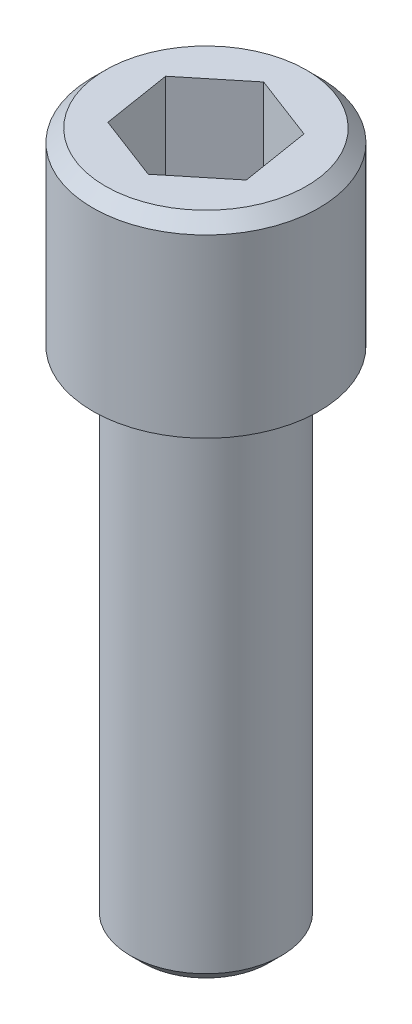
ISO-10303-21;
HEADER;
FILE_DESCRIPTION(('STEP AP214'),'2;1');
FILE_NAME('part.step','',(''),(''),'','','');
FILE_SCHEMA(('AUTOMOTIVE_DESIGN { 1 0 10303 214 1 1 1 1 }'));
ENDSEC;
DATA;
#1=APPLICATION_CONTEXT('core data for automotive mechanical design processes');
#2=APPLICATION_PROTOCOL_DEFINITION('international standard','automotive_design',2000,#1);
#3=PRODUCT_CONTEXT('',#1,'mechanical');
#4=PRODUCT('Part','Part','',(#3));
#5=PRODUCT_RELATED_PRODUCT_CATEGORY('part','',(#4));
#6=PRODUCT_DEFINITION_FORMATION('','',#4);
#7=PRODUCT_DEFINITION_CONTEXT('part definition',#1,'design');
#8=PRODUCT_DEFINITION('design','',#6,#7);
#9=PRODUCT_DEFINITION_SHAPE('','',#8);
#10=(LENGTH_UNIT() NAMED_UNIT(*) SI_UNIT(.MILLI.,.METRE.));
#11=(NAMED_UNIT(*) PLANE_ANGLE_UNIT() SI_UNIT($,.RADIAN.));
#12=(NAMED_UNIT(*) SI_UNIT($,.STERADIAN.) SOLID_ANGLE_UNIT());
#13=UNCERTAINTY_MEASURE_WITH_UNIT(LENGTH_MEASURE(1.E-05),#10,'distance_accuracy_value','');
#14=(GEOMETRIC_REPRESENTATION_CONTEXT(3) GLOBAL_UNCERTAINTY_ASSIGNED_CONTEXT((#13)) GLOBAL_UNIT_ASSIGNED_CONTEXT((#10,
#11,#12)) REPRESENTATION_CONTEXT('',''));
#15=CARTESIAN_POINT('',(0.,0.,0.));
#16=DIRECTION('',(0.,0.,1.));
#17=DIRECTION('',(1.,0.,0.));
#18=AXIS2_PLACEMENT_3D('',#15,#16,#17);
#19=CARTESIAN_POINT('',(0.,10.,0.));
#20=DIRECTION('',(0.,-1.,0.));
#21=DIRECTION('',(0.,0.,-1.));
#22=AXIS2_PLACEMENT_3D('',#19,#20,#21);
#23=CYLINDRICAL_SURFACE('',#22,1.5);
#24=CARTESIAN_POINT('',(0.,0.25,0.));
#25=DIRECTION('',(0.,1.,0.));
#26=DIRECTION('',(0.,0.,1.));
#27=AXIS2_PLACEMENT_3D('',#24,#25,#26);
#28=CIRCLE('',#27,1.5);
#29=CARTESIAN_POINT('',(0.,0.25,1.5));
#30=VERTEX_POINT('',#29);
#31=EDGE_CURVE('E41',#30,#30,#28,.T.);
#32=ORIENTED_EDGE('',*,*,#31,.T.);
#33=EDGE_LOOP('',(#32));
#34=FACE_BOUND('',#33,.T.);
#35=CARTESIAN_POINT('',(0.,10.,0.));
#36=DIRECTION('',(0.,1.,0.));
#37=DIRECTION('',(0.,0.,1.));
#38=AXIS2_PLACEMENT_3D('',#35,#36,#37);
#39=CIRCLE('',#38,1.5);
#40=CARTESIAN_POINT('',(0.,10.,1.5));
#41=VERTEX_POINT('',#40);
#42=EDGE_CURVE('E143',#41,#41,#39,.T.);
#43=ORIENTED_EDGE('',*,*,#42,.F.);
#44=EDGE_LOOP('',(#43));
#45=FACE_BOUND('',#44,.T.);
#46=ADVANCED_FACE('F33',(#34,#45),#23,.T.);
#47=CARTESIAN_POINT('',(0.,0.,0.));
#48=DIRECTION('',(0.,1.,0.));
#49=DIRECTION('',(0.,0.,1.));
#50=AXIS2_PLACEMENT_3D('',#47,#48,#49);
#51=PLANE('',#50);
#52=CARTESIAN_POINT('',(0.,0.,0.));
#53=DIRECTION('',(0.,1.,0.));
#54=DIRECTION('',(0.,0.,1.));
#55=AXIS2_PLACEMENT_3D('',#52,#53,#54);
#56=CIRCLE('',#55,1.25);
#57=CARTESIAN_POINT('',(0.,0.,1.25));
#58=VERTEX_POINT('',#57);
#59=EDGE_CURVE('E11',#58,#58,#56,.F.);
#60=ORIENTED_EDGE('',*,*,#59,.T.);
#61=EDGE_LOOP('',(#60));
#62=FACE_BOUND('',#61,.T.);
#63=ADVANCED_FACE('F165',(#62),#51,.F.);
#64=CARTESIAN_POINT('',(0.,13.75,0.));
#65=DIRECTION('',(0.,-1.,0.));
#66=DIRECTION('',(0.,0.,-1.));
#67=AXIS2_PLACEMENT_3D('',#64,#65,#66);
#68=CYLINDRICAL_SURFACE('',#67,2.25);
#69=CARTESIAN_POINT('',(0.,13.5,0.));
#70=DIRECTION('',(0.,1.,0.));
#71=DIRECTION('',(0.,0.,1.));
#72=AXIS2_PLACEMENT_3D('',#69,#70,#71);
#73=CIRCLE('',#72,2.25);
#74=CARTESIAN_POINT('',(0.,13.5,2.25));
#75=VERTEX_POINT('',#74);
#76=EDGE_CURVE('E149',#75,#75,#73,.F.);
#77=ORIENTED_EDGE('',*,*,#76,.T.);
#78=EDGE_LOOP('',(#77));
#79=FACE_BOUND('',#78,.T.);
#80=CARTESIAN_POINT('',(0.,10.,0.));
#81=DIRECTION('',(0.,1.,0.));
#82=DIRECTION('',(0.,0.,1.));
#83=AXIS2_PLACEMENT_3D('',#80,#81,#82);
#84=CIRCLE('',#83,2.25);
#85=CARTESIAN_POINT('',(0.,10.,2.25));
#86=VERTEX_POINT('',#85);
#87=EDGE_CURVE('E135',#86,#86,#84,.T.);
#88=ORIENTED_EDGE('',*,*,#87,.T.);
#89=EDGE_LOOP('',(#88));
#90=FACE_BOUND('',#89,.T.);
#91=ADVANCED_FACE('F170',(#79,#90),#68,.T.);
#92=CARTESIAN_POINT('',(0.,13.75,0.));
#93=DIRECTION('',(0.,1.,0.));
#94=DIRECTION('',(0.,0.,1.));
#95=AXIS2_PLACEMENT_3D('',#92,#93,#94);
#96=PLANE('',#95);
#97=CARTESIAN_POINT('',(0.,13.75,0.));
#98=DIRECTION('',(0.,1.,0.));
#99=DIRECTION('',(0.,0.,1.));
#100=AXIS2_PLACEMENT_3D('',#97,#98,#99);
#101=CIRCLE('',#100,2.);
#102=CARTESIAN_POINT('',(0.,13.75,2.));
#103=VERTEX_POINT('',#102);
#104=EDGE_CURVE('E146',#103,#103,#101,.T.);
#105=ORIENTED_EDGE('',*,*,#104,.T.);
#106=EDGE_LOOP('',(#105));
#107=FACE_BOUND('',#106,.T.);
#108=DIRECTION('',(0.159195520088402,0.,0.987247074639263));
#109=VECTOR('',#108,1.);
#110=CARTESIAN_POINT('',(-1.2949903812193,13.75,-0.492950213053497));
#111=LINE('',#110,#109);
#112=CARTESIAN_POINT('',(-1.2949903812193,13.75,-0.492950213053497));
#113=VERTEX_POINT('',#112);
#114=CARTESIAN_POINT('',(-1.07440259791493,13.75,0.875019461265662));
#115=VERTEX_POINT('',#114);
#116=EDGE_CURVE('E48',#113,#115,#111,.T.);
#117=ORIENTED_EDGE('',*,*,#116,.F.);
#118=DIRECTION('',(-0.775383286405273,0.,0.631490901884864));
#119=VECTOR('',#118,1.);
#120=CARTESIAN_POINT('',(-0.220587783304371,13.75,-1.36796967431916));
#121=LINE('',#120,#119);
#122=CARTESIAN_POINT('',(-0.220587783304371,13.75,-1.36796967431916));
#123=VERTEX_POINT('',#122);
#124=EDGE_CURVE('E131',#123,#113,#121,.T.);
#125=ORIENTED_EDGE('',*,*,#124,.F.);
#126=DIRECTION('',(-0.934578806493675,0.,-0.3557561727544));
#127=VECTOR('',#126,1.);
#128=CARTESIAN_POINT('',(1.07440259791493,13.75,-0.875019461265662));
#129=LINE('',#128,#127);
#130=CARTESIAN_POINT('',(1.07440259791493,13.75,-0.875019461265662));
#131=VERTEX_POINT('',#130);
#132=EDGE_CURVE('E129',#131,#123,#129,.T.);
#133=ORIENTED_EDGE('',*,*,#132,.F.);
#134=DIRECTION('',(-0.159195520088402,0.,-0.987247074639263));
#135=VECTOR('',#134,1.);
#136=CARTESIAN_POINT('',(1.2949903812193,13.75,0.492950213053496));
#137=LINE('',#136,#135);
#138=CARTESIAN_POINT('',(1.2949903812193,13.75,0.492950213053496));
#139=VERTEX_POINT('',#138);
#140=EDGE_CURVE('E96',#139,#131,#137,.T.);
#141=ORIENTED_EDGE('',*,*,#140,.F.);
#142=DIRECTION('',(0.775383286405273,0.,-0.631490901884864));
#143=VECTOR('',#142,1.);
#144=CARTESIAN_POINT('',(0.220587783304371,13.75,1.36796967431916));
#145=LINE('',#144,#143);
#146=CARTESIAN_POINT('',(0.220587783304371,13.75,1.36796967431916));
#147=VERTEX_POINT('',#146);
#148=EDGE_CURVE('E125',#147,#139,#145,.T.);
#149=ORIENTED_EDGE('',*,*,#148,.F.);
#150=DIRECTION('',(0.934578806493675,0.,0.3557561727544));
#151=VECTOR('',#150,1.);
#152=CARTESIAN_POINT('',(-1.07440259791493,13.75,0.875019461265662));
#153=LINE('',#152,#151);
#154=EDGE_CURVE('E122',#115,#147,#153,.T.);
#155=ORIENTED_EDGE('',*,*,#154,.F.);
#156=EDGE_LOOP('',(#117,#125,#133,#141,#149,#155));
#157=FACE_BOUND('',#156,.T.);
#158=ADVANCED_FACE('F176',(#107,#157),#96,.T.);
#159=CARTESIAN_POINT('',(0.,10.,0.));
#160=DIRECTION('',(0.,1.,0.));
#161=DIRECTION('',(0.,0.,1.));
#162=AXIS2_PLACEMENT_3D('',#159,#160,#161);
#163=PLANE('',#162);
#164=ORIENTED_EDGE('',*,*,#42,.T.);
#165=EDGE_LOOP('',(#164));
#166=FACE_BOUND('',#165,.T.);
#167=ORIENTED_EDGE('',*,*,#87,.F.);
#168=EDGE_LOOP('',(#167));
#169=FACE_BOUND('',#168,.T.);
#170=ADVANCED_FACE('F178',(#166,#169),#163,.F.);
#171=CARTESIAN_POINT('',(-1.2949903812193,11.5,-0.492950213053497));
#172=DIRECTION('',(-0.987247074639263,0.,0.159195520088402));
#173=DIRECTION('',(0.159195520088402,0.,0.987247074639263));
#174=AXIS2_PLACEMENT_3D('',#171,#172,#173);
#175=PLANE('',#174);
#176=ORIENTED_EDGE('',*,*,#116,.T.);
#177=DIRECTION('',(0.,1.,0.));
#178=VECTOR('',#177,1.);
#179=CARTESIAN_POINT('',(-1.07440259791493,11.5,0.875019461265662));
#180=LINE('',#179,#178);
#181=CARTESIAN_POINT('',(-1.07440259791493,11.5,0.875019461265662));
#182=VERTEX_POINT('',#181);
#183=EDGE_CURVE('E78',#182,#115,#180,.T.);
#184=ORIENTED_EDGE('',*,*,#183,.F.);
#185=DIRECTION('',(0.159195520088402,0.,0.987247074639263));
#186=VECTOR('',#185,1.);
#187=CARTESIAN_POINT('',(-1.2949903812193,11.5,-0.492950213053497));
#188=LINE('',#187,#186);
#189=CARTESIAN_POINT('',(-1.2949903812193,11.5,-0.492950213053497));
#190=VERTEX_POINT('',#189);
#191=EDGE_CURVE('E133',#190,#182,#188,.T.);
#192=ORIENTED_EDGE('',*,*,#191,.F.);
#193=DIRECTION('',(0.,1.,0.));
#194=VECTOR('',#193,1.);
#195=CARTESIAN_POINT('',(-1.2949903812193,11.5,-0.492950213053497));
#196=LINE('',#195,#194);
#197=EDGE_CURVE('E56',#190,#113,#196,.T.);
#198=ORIENTED_EDGE('',*,*,#197,.T.);
#199=EDGE_LOOP('',(#176,#184,#192,#198));
#200=FACE_BOUND('',#199,.T.);
#201=ADVANCED_FACE('F181',(#200),#175,.F.);
#202=CARTESIAN_POINT('',(-0.220587783304371,11.5,-1.36796967431916));
#203=DIRECTION('',(-0.631490901884864,0.,-0.775383286405273));
#204=DIRECTION('',(-0.775383286405273,0.,0.631490901884864));
#205=AXIS2_PLACEMENT_3D('',#202,#203,#204);
#206=PLANE('',#205);
#207=ORIENTED_EDGE('',*,*,#124,.T.);
#208=ORIENTED_EDGE('',*,*,#197,.F.);
#209=DIRECTION('',(-0.775383286405273,0.,0.631490901884864));
#210=VECTOR('',#209,1.);
#211=CARTESIAN_POINT('',(-0.220587783304371,11.5,-1.36796967431916));
#212=LINE('',#211,#210);
#213=CARTESIAN_POINT('',(-0.220587783304371,11.5,-1.36796967431916));
#214=VERTEX_POINT('',#213);
#215=EDGE_CURVE('E108',#214,#190,#212,.T.);
#216=ORIENTED_EDGE('',*,*,#215,.F.);
#217=DIRECTION('',(0.,1.,0.));
#218=VECTOR('',#217,1.);
#219=CARTESIAN_POINT('',(-0.220587783304371,11.5,-1.36796967431916));
#220=LINE('',#219,#218);
#221=EDGE_CURVE('E100',#214,#123,#220,.T.);
#222=ORIENTED_EDGE('',*,*,#221,.T.);
#223=EDGE_LOOP('',(#207,#208,#216,#222));
#224=FACE_BOUND('',#223,.T.);
#225=ADVANCED_FACE('F188',(#224),#206,.F.);
#226=CARTESIAN_POINT('',(1.07440259791493,11.5,-0.875019461265662));
#227=DIRECTION('',(0.3557561727544,0.,-0.934578806493675));
#228=DIRECTION('',(-0.934578806493675,0.,-0.3557561727544));
#229=AXIS2_PLACEMENT_3D('',#226,#227,#228);
#230=PLANE('',#229);
#231=ORIENTED_EDGE('',*,*,#132,.T.);
#232=ORIENTED_EDGE('',*,*,#221,.F.);
#233=DIRECTION('',(-0.934578806493675,0.,-0.3557561727544));
#234=VECTOR('',#233,1.);
#235=CARTESIAN_POINT('',(1.07440259791493,11.5,-0.875019461265662));
#236=LINE('',#235,#234);
#237=CARTESIAN_POINT('',(1.07440259791493,11.5,-0.875019461265662));
#238=VERTEX_POINT('',#237);
#239=EDGE_CURVE('E104',#238,#214,#236,.T.);
#240=ORIENTED_EDGE('',*,*,#239,.F.);
#241=DIRECTION('',(0.,1.,0.));
#242=VECTOR('',#241,1.);
#243=CARTESIAN_POINT('',(1.07440259791493,11.5,-0.875019461265662));
#244=LINE('',#243,#242);
#245=EDGE_CURVE('E89',#238,#131,#244,.T.);
#246=ORIENTED_EDGE('',*,*,#245,.T.);
#247=EDGE_LOOP('',(#231,#232,#240,#246));
#248=FACE_BOUND('',#247,.T.);
#249=ADVANCED_FACE('F105',(#248),#230,.F.);
#250=CARTESIAN_POINT('',(1.2949903812193,11.5,0.492950213053496));
#251=DIRECTION('',(0.987247074639263,0.,-0.159195520088402));
#252=DIRECTION('',(-0.159195520088403,0.,-0.987247074639263));
#253=AXIS2_PLACEMENT_3D('',#250,#251,#252);
#254=PLANE('',#253);
#255=ORIENTED_EDGE('',*,*,#140,.T.);
#256=ORIENTED_EDGE('',*,*,#245,.F.);
#257=DIRECTION('',(-0.159195520088402,0.,-0.987247074639263));
#258=VECTOR('',#257,1.);
#259=CARTESIAN_POINT('',(1.2949903812193,11.5,0.492950213053496));
#260=LINE('',#259,#258);
#261=CARTESIAN_POINT('',(1.2949903812193,11.5,0.492950213053496));
#262=VERTEX_POINT('',#261);
#263=EDGE_CURVE('E93',#262,#238,#260,.T.);
#264=ORIENTED_EDGE('',*,*,#263,.F.);
#265=DIRECTION('',(0.,1.,0.));
#266=VECTOR('',#265,1.);
#267=CARTESIAN_POINT('',(1.2949903812193,11.5,0.492950213053496));
#268=LINE('',#267,#266);
#269=EDGE_CURVE('E101',#262,#139,#268,.T.);
#270=ORIENTED_EDGE('',*,*,#269,.T.);
#271=EDGE_LOOP('',(#255,#256,#264,#270));
#272=FACE_BOUND('',#271,.T.);
#273=ADVANCED_FACE('F91',(#272),#254,.F.);
#274=CARTESIAN_POINT('',(0.220587783304371,11.5,1.36796967431916));
#275=DIRECTION('',(0.631490901884864,0.,0.775383286405273));
#276=DIRECTION('',(0.775383286405273,0.,-0.631490901884864));
#277=AXIS2_PLACEMENT_3D('',#274,#275,#276);
#278=PLANE('',#277);
#279=ORIENTED_EDGE('',*,*,#148,.T.);
#280=ORIENTED_EDGE('',*,*,#269,.F.);
#281=DIRECTION('',(0.775383286405273,0.,-0.631490901884864));
#282=VECTOR('',#281,1.);
#283=CARTESIAN_POINT('',(0.220587783304371,11.5,1.36796967431916));
#284=LINE('',#283,#282);
#285=CARTESIAN_POINT('',(0.220587783304371,11.5,1.36796967431916));
#286=VERTEX_POINT('',#285);
#287=EDGE_CURVE('E114',#286,#262,#284,.T.);
#288=ORIENTED_EDGE('',*,*,#287,.F.);
#289=DIRECTION('',(0.,1.,0.));
#290=VECTOR('',#289,1.);
#291=CARTESIAN_POINT('',(0.220587783304371,11.5,1.36796967431916));
#292=LINE('',#291,#290);
#293=EDGE_CURVE('E138',#286,#147,#292,.T.);
#294=ORIENTED_EDGE('',*,*,#293,.T.);
#295=EDGE_LOOP('',(#279,#280,#288,#294));
#296=FACE_BOUND('',#295,.T.);
#297=ADVANCED_FACE('F192',(#296),#278,.F.);
#298=CARTESIAN_POINT('',(-1.07440259791493,11.5,0.875019461265662));
#299=DIRECTION('',(-0.3557561727544,0.,0.934578806493675));
#300=DIRECTION('',(0.934578806493675,0.,0.3557561727544));
#301=AXIS2_PLACEMENT_3D('',#298,#299,#300);
#302=PLANE('',#301);
#303=ORIENTED_EDGE('',*,*,#154,.T.);
#304=ORIENTED_EDGE('',*,*,#293,.F.);
#305=DIRECTION('',(0.934578806493675,0.,0.3557561727544));
#306=VECTOR('',#305,1.);
#307=CARTESIAN_POINT('',(-1.07440259791493,11.5,0.875019461265662));
#308=LINE('',#307,#306);
#309=EDGE_CURVE('E116',#182,#286,#308,.T.);
#310=ORIENTED_EDGE('',*,*,#309,.F.);
#311=ORIENTED_EDGE('',*,*,#183,.T.);
#312=EDGE_LOOP('',(#303,#304,#310,#311));
#313=FACE_BOUND('',#312,.T.);
#314=ADVANCED_FACE('F189',(#313),#302,.F.);
#315=CARTESIAN_POINT('',(0.,11.5,0.));
#316=DIRECTION('',(0.,1.,0.));
#317=DIRECTION('',(0.,0.,1.));
#318=AXIS2_PLACEMENT_3D('',#315,#316,#317);
#319=PLANE('',#318);
#320=ORIENTED_EDGE('',*,*,#191,.T.);
#321=ORIENTED_EDGE('',*,*,#309,.T.);
#322=ORIENTED_EDGE('',*,*,#287,.T.);
#323=ORIENTED_EDGE('',*,*,#263,.T.);
#324=ORIENTED_EDGE('',*,*,#239,.T.);
#325=ORIENTED_EDGE('',*,*,#215,.T.);
#326=EDGE_LOOP('',(#320,#321,#322,#323,#324,#325));
#327=FACE_BOUND('',#326,.T.);
#328=ADVANCED_FACE('F111',(#327),#319,.T.);
#329=CARTESIAN_POINT('',(0.,13.75,0.));
#330=DIRECTION('',(0.,-1.,0.));
#331=DIRECTION('',(0.,0.,-1.));
#332=AXIS2_PLACEMENT_3D('',#329,#330,#331);
#333=CONICAL_SURFACE('',#332,2.,0.785398163397447);
#334=ORIENTED_EDGE('',*,*,#76,.F.);
#335=EDGE_LOOP('',(#334));
#336=FACE_BOUND('',#335,.T.);
#337=ORIENTED_EDGE('',*,*,#104,.F.);
#338=EDGE_LOOP('',(#337));
#339=FACE_BOUND('',#338,.T.);
#340=ADVANCED_FACE('F157',(#336,#339),#333,.T.);
#341=CARTESIAN_POINT('',(0.,0.25,0.));
#342=DIRECTION('',(0.,1.,0.));
#343=DIRECTION('',(0.,0.,1.));
#344=AXIS2_PLACEMENT_3D('',#341,#342,#343);
#345=CONICAL_SURFACE('',#344,1.5,0.785398163397449);
#346=ORIENTED_EDGE('',*,*,#59,.F.);
#347=EDGE_LOOP('',(#346));
#348=FACE_BOUND('',#347,.T.);
#349=ORIENTED_EDGE('',*,*,#31,.F.);
#350=EDGE_LOOP('',(#349));
#351=FACE_BOUND('',#350,.T.);
#352=ADVANCED_FACE('F35',(#348,#351),#345,.T.);
#353=CLOSED_SHELL('',(#46,#63,#91,#158,#170,#201,#225,#249,#273,#297,#314,#328,#340,#352));
#354=MANIFOLD_SOLID_BREP('B2',#353);
#355=ADVANCED_BREP_SHAPE_REPRESENTATION('',(#18,#354),#14);
#356=SHAPE_DEFINITION_REPRESENTATION(#9,#355);
ENDSEC;
END-ISO-10303-21;
